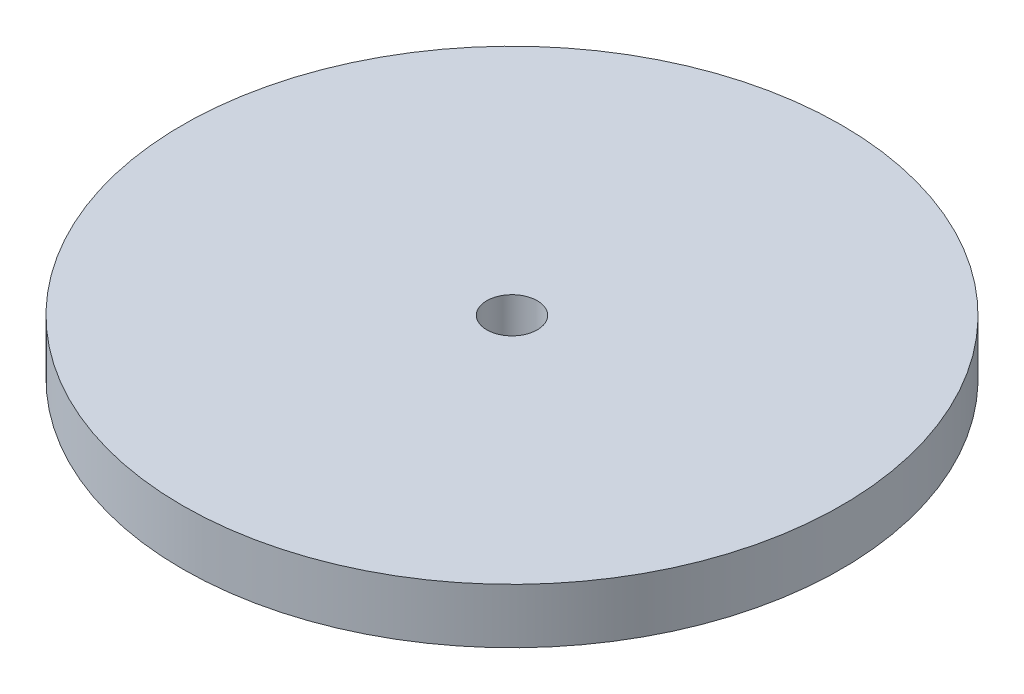
ISO-10303-21;
HEADER;
FILE_DESCRIPTION(('STEP AP214'),'2;1');
FILE_NAME('part.step','',(''),(''),'','','');
FILE_SCHEMA(('AUTOMOTIVE_DESIGN { 1 0 10303 214 1 1 1 1 }'));
ENDSEC;
DATA;
#1=APPLICATION_CONTEXT('core data for automotive mechanical design processes');
#2=APPLICATION_PROTOCOL_DEFINITION('international standard','automotive_design',2000,#1);
#3=PRODUCT_CONTEXT('',#1,'mechanical');
#4=PRODUCT('Part','Part','',(#3));
#5=PRODUCT_RELATED_PRODUCT_CATEGORY('part','',(#4));
#6=PRODUCT_DEFINITION_FORMATION('','',#4);
#7=PRODUCT_DEFINITION_CONTEXT('part definition',#1,'design');
#8=PRODUCT_DEFINITION('design','',#6,#7);
#9=PRODUCT_DEFINITION_SHAPE('','',#8);
#10=(LENGTH_UNIT() NAMED_UNIT(*) SI_UNIT(.MILLI.,.METRE.));
#11=(NAMED_UNIT(*) PLANE_ANGLE_UNIT() SI_UNIT($,.RADIAN.));
#12=(NAMED_UNIT(*) SI_UNIT($,.STERADIAN.) SOLID_ANGLE_UNIT());
#13=UNCERTAINTY_MEASURE_WITH_UNIT(LENGTH_MEASURE(1.E-05),#10,'distance_accuracy_value','');
#14=(GEOMETRIC_REPRESENTATION_CONTEXT(3) GLOBAL_UNCERTAINTY_ASSIGNED_CONTEXT((#13)) GLOBAL_UNIT_ASSIGNED_CONTEXT((#10,
#11,#12)) REPRESENTATION_CONTEXT('',''));
#15=CARTESIAN_POINT('',(0.,0.,0.));
#16=DIRECTION('',(0.,0.,1.));
#17=DIRECTION('',(1.,0.,0.));
#18=AXIS2_PLACEMENT_3D('',#15,#16,#17);
#19=CARTESIAN_POINT('',(0.,3.175,0.));
#20=DIRECTION('',(0.,-1.,0.));
#21=DIRECTION('',(0.,0.,-1.));
#22=AXIS2_PLACEMENT_3D('',#19,#20,#21);
#23=CYLINDRICAL_SURFACE('',#22,19.05);
#24=CARTESIAN_POINT('',(0.,3.175,0.));
#25=DIRECTION('',(0.,1.,0.));
#26=DIRECTION('',(0.,0.,1.));
#27=AXIS2_PLACEMENT_3D('',#24,#25,#26);
#28=CIRCLE('',#27,19.05);
#29=CARTESIAN_POINT('',(0.,3.175,19.05));
#30=VERTEX_POINT('',#29);
#31=EDGE_CURVE('E10',#30,#30,#28,.T.);
#32=ORIENTED_EDGE('',*,*,#31,.F.);
#33=EDGE_LOOP('',(#32));
#34=FACE_BOUND('',#33,.T.);
#35=CARTESIAN_POINT('',(0.,0.,0.));
#36=DIRECTION('',(0.,1.,0.));
#37=DIRECTION('',(0.,0.,1.));
#38=AXIS2_PLACEMENT_3D('',#35,#36,#37);
#39=CIRCLE('',#38,19.05);
#40=CARTESIAN_POINT('',(0.,0.,19.05));
#41=VERTEX_POINT('',#40);
#42=EDGE_CURVE('E37',#41,#41,#39,.T.);
#43=ORIENTED_EDGE('',*,*,#42,.T.);
#44=EDGE_LOOP('',(#43));
#45=FACE_BOUND('',#44,.T.);
#46=ADVANCED_FACE('F40',(#34,#45),#23,.T.);
#47=CARTESIAN_POINT('',(0.,3.175,0.));
#48=DIRECTION('',(0.,1.,0.));
#49=DIRECTION('',(0.,0.,1.));
#50=AXIS2_PLACEMENT_3D('',#47,#48,#49);
#51=PLANE('',#50);
#52=CARTESIAN_POINT('',(0.,3.175,0.));
#53=DIRECTION('',(0.,1.,0.));
#54=DIRECTION('',(0.,0.,1.));
#55=AXIS2_PLACEMENT_3D('',#52,#53,#54);
#56=CIRCLE('',#55,1.4605);
#57=CARTESIAN_POINT('',(0.,3.175,1.4605));
#58=VERTEX_POINT('',#57);
#59=EDGE_CURVE('E47',#58,#58,#56,.T.);
#60=ORIENTED_EDGE('',*,*,#59,.F.);
#61=EDGE_LOOP('',(#60));
#62=FACE_BOUND('',#61,.T.);
#63=ORIENTED_EDGE('',*,*,#31,.T.);
#64=EDGE_LOOP('',(#63));
#65=FACE_BOUND('',#64,.T.);
#66=ADVANCED_FACE('F61',(#62,#65),#51,.T.);
#67=CARTESIAN_POINT('',(0.,0.,0.));
#68=DIRECTION('',(0.,1.,0.));
#69=DIRECTION('',(0.,0.,1.));
#70=AXIS2_PLACEMENT_3D('',#67,#68,#69);
#71=PLANE('',#70);
#72=CARTESIAN_POINT('',(0.,0.,0.));
#73=DIRECTION('',(0.,1.,0.));
#74=DIRECTION('',(0.,0.,1.));
#75=AXIS2_PLACEMENT_3D('',#72,#73,#74);
#76=CIRCLE('',#75,1.4605);
#77=CARTESIAN_POINT('',(0.,0.,1.4605));
#78=VERTEX_POINT('',#77);
#79=EDGE_CURVE('E50',#78,#78,#76,.T.);
#80=ORIENTED_EDGE('',*,*,#79,.T.);
#81=EDGE_LOOP('',(#80));
#82=FACE_BOUND('',#81,.T.);
#83=ORIENTED_EDGE('',*,*,#42,.F.);
#84=EDGE_LOOP('',(#83));
#85=FACE_BOUND('',#84,.T.);
#86=ADVANCED_FACE('F54',(#82,#85),#71,.F.);
#87=CARTESIAN_POINT('',(0.,0.,0.));
#88=DIRECTION('',(0.,1.,0.));
#89=DIRECTION('',(0.,0.,1.));
#90=AXIS2_PLACEMENT_3D('',#87,#88,#89);
#91=CYLINDRICAL_SURFACE('',#90,1.4605);
#92=ORIENTED_EDGE('',*,*,#79,.F.);
#93=EDGE_LOOP('',(#92));
#94=FACE_BOUND('',#93,.T.);
#95=ORIENTED_EDGE('',*,*,#59,.T.);
#96=EDGE_LOOP('',(#95));
#97=FACE_BOUND('',#96,.T.);
#98=ADVANCED_FACE('F59',(#94,#97),#91,.F.);
#99=CLOSED_SHELL('',(#46,#66,#86,#98));
#100=MANIFOLD_SOLID_BREP('B2',#99);
#101=ADVANCED_BREP_SHAPE_REPRESENTATION('',(#18,#100),#14);
#102=SHAPE_DEFINITION_REPRESENTATION(#9,#101);
ENDSEC;
END-ISO-10303-21;
